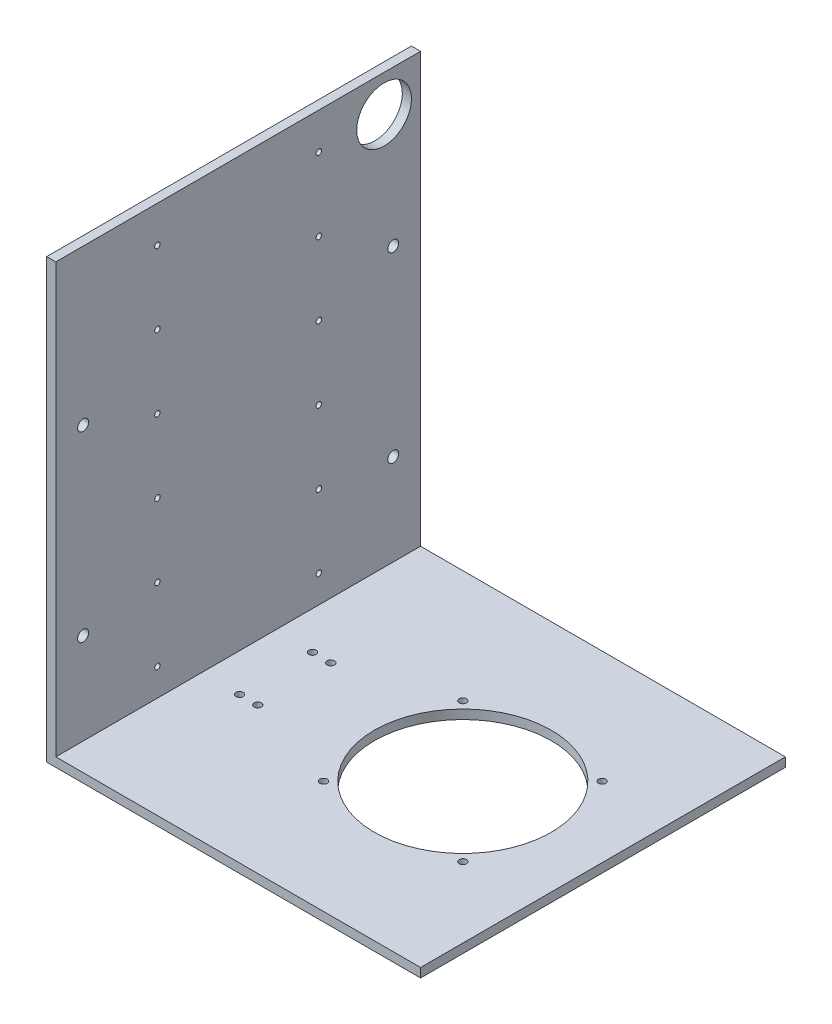
ISO-10303-21;
HEADER;
FILE_DESCRIPTION(('STEP AP214'),'2;1');
FILE_NAME('part.step','',(''),(''),'','','');
FILE_SCHEMA(('AUTOMOTIVE_DESIGN { 1 0 10303 214 1 1 1 1 }'));
ENDSEC;
DATA;
#1=APPLICATION_CONTEXT('core data for automotive mechanical design processes');
#2=APPLICATION_PROTOCOL_DEFINITION('international standard','automotive_design',2000,#1);
#3=PRODUCT_CONTEXT('',#1,'mechanical');
#4=PRODUCT('Part','Part','',(#3));
#5=PRODUCT_RELATED_PRODUCT_CATEGORY('part','',(#4));
#6=PRODUCT_DEFINITION_FORMATION('','',#4);
#7=PRODUCT_DEFINITION_CONTEXT('part definition',#1,'design');
#8=PRODUCT_DEFINITION('design','',#6,#7);
#9=PRODUCT_DEFINITION_SHAPE('','',#8);
#10=(LENGTH_UNIT() NAMED_UNIT(*) SI_UNIT(.MILLI.,.METRE.));
#11=(NAMED_UNIT(*) PLANE_ANGLE_UNIT() SI_UNIT($,.RADIAN.));
#12=(NAMED_UNIT(*) SI_UNIT($,.STERADIAN.) SOLID_ANGLE_UNIT());
#13=UNCERTAINTY_MEASURE_WITH_UNIT(LENGTH_MEASURE(1.E-05),#10,'distance_accuracy_value','');
#14=(GEOMETRIC_REPRESENTATION_CONTEXT(3) GLOBAL_UNCERTAINTY_ASSIGNED_CONTEXT((#13)) GLOBAL_UNIT_ASSIGNED_CONTEXT((#10,
#11,#12)) REPRESENTATION_CONTEXT('',''));
#15=CARTESIAN_POINT('',(0.,0.,0.));
#16=DIRECTION('',(0.,0.,1.));
#17=DIRECTION('',(1.,0.,0.));
#18=AXIS2_PLACEMENT_3D('',#15,#16,#17);
#19=CARTESIAN_POINT('',(5.00000000000001,240.,200.));
#20=DIRECTION('',(0.,-1.,0.));
#21=DIRECTION('',(0.,0.,-1.));
#22=AXIS2_PLACEMENT_3D('',#19,#20,#21);
#23=PLANE('',#22);
#24=DIRECTION('',(-1.,0.,0.));
#25=VECTOR('',#24,1.);
#26=CARTESIAN_POINT('',(5.00000000000001,240.,0.));
#27=LINE('',#26,#25);
#28=CARTESIAN_POINT('',(5.00000000000001,240.,0.));
#29=VERTEX_POINT('',#28);
#30=CARTESIAN_POINT('',(0.,240.,0.));
#31=VERTEX_POINT('',#30);
#32=EDGE_CURVE('E128',#29,#31,#27,.T.);
#33=ORIENTED_EDGE('',*,*,#32,.T.);
#34=DIRECTION('',(0.,0.,-1.));
#35=VECTOR('',#34,1.);
#36=CARTESIAN_POINT('',(0.,240.,200.));
#37=LINE('',#36,#35);
#38=CARTESIAN_POINT('',(0.,240.,200.));
#39=VERTEX_POINT('',#38);
#40=EDGE_CURVE('E13',#39,#31,#37,.T.);
#41=ORIENTED_EDGE('',*,*,#40,.F.);
#42=DIRECTION('',(-1.,0.,0.));
#43=VECTOR('',#42,1.);
#44=CARTESIAN_POINT('',(5.00000000000001,240.,200.));
#45=LINE('',#44,#43);
#46=CARTESIAN_POINT('',(5.00000000000001,240.,200.));
#47=VERTEX_POINT('',#46);
#48=EDGE_CURVE('E139',#47,#39,#45,.T.);
#49=ORIENTED_EDGE('',*,*,#48,.F.);
#50=DIRECTION('',(0.,0.,-1.));
#51=VECTOR('',#50,1.);
#52=CARTESIAN_POINT('',(5.00000000000001,240.,200.));
#53=LINE('',#52,#51);
#54=EDGE_CURVE('E124',#47,#29,#53,.T.);
#55=ORIENTED_EDGE('',*,*,#54,.T.);
#56=EDGE_LOOP('',(#33,#41,#49,#55));
#57=FACE_BOUND('',#56,.T.);
#58=ADVANCED_FACE('F44',(#57),#23,.F.);
#59=CARTESIAN_POINT('',(0.,240.,200.));
#60=DIRECTION('',(1.,0.,0.));
#61=DIRECTION('',(0.,1.,0.));
#62=AXIS2_PLACEMENT_3D('',#59,#60,#61);
#63=PLANE('',#62);
#64=CARTESIAN_POINT('',(0.,140.,55.7499999999992));
#65=DIRECTION('',(1.,0.,0.));
#66=DIRECTION('',(0.,1.,0.));
#67=AXIS2_PLACEMENT_3D('',#64,#65,#66);
#68=CIRCLE('',#67,1.5);
#69=CARTESIAN_POINT('',(0.,141.5,55.7499999999992));
#70=VERTEX_POINT('',#69);
#71=EDGE_CURVE('E595',#70,#70,#68,.F.);
#72=ORIENTED_EDGE('',*,*,#71,.F.);
#73=EDGE_LOOP('',(#72));
#74=FACE_BOUND('',#73,.T.);
#75=CARTESIAN_POINT('',(0.,99.9999999999999,144.249999999999));
#76=DIRECTION('',(1.,0.,0.));
#77=DIRECTION('',(0.,1.,0.));
#78=AXIS2_PLACEMENT_3D('',#75,#76,#77);
#79=CIRCLE('',#78,1.5);
#80=CARTESIAN_POINT('',(0.,101.5,144.249999999999));
#81=VERTEX_POINT('',#80);
#82=EDGE_CURVE('E600',#81,#81,#79,.F.);
#83=ORIENTED_EDGE('',*,*,#82,.F.);
#84=EDGE_LOOP('',(#83));
#85=FACE_BOUND('',#84,.T.);
#86=CARTESIAN_POINT('',(0.,99.9999999999999,55.7499999999988));
#87=DIRECTION('',(1.,0.,0.));
#88=DIRECTION('',(0.,1.,0.));
#89=AXIS2_PLACEMENT_3D('',#86,#87,#88);
#90=CIRCLE('',#89,1.5);
#91=CARTESIAN_POINT('',(0.,101.5,55.7499999999988));
#92=VERTEX_POINT('',#91);
#93=EDGE_CURVE('E607',#92,#92,#90,.F.);
#94=ORIENTED_EDGE('',*,*,#93,.F.);
#95=EDGE_LOOP('',(#94));
#96=FACE_BOUND('',#95,.T.);
#97=CARTESIAN_POINT('',(0.,59.9999999999999,144.249999999998));
#98=DIRECTION('',(1.,0.,0.));
#99=DIRECTION('',(0.,1.,0.));
#100=AXIS2_PLACEMENT_3D('',#97,#98,#99);
#101=CIRCLE('',#100,1.5);
#102=CARTESIAN_POINT('',(0.,61.4999999999999,144.249999999998));
#103=VERTEX_POINT('',#102);
#104=EDGE_CURVE('E611',#103,#103,#101,.F.);
#105=ORIENTED_EDGE('',*,*,#104,.F.);
#106=EDGE_LOOP('',(#105));
#107=FACE_BOUND('',#106,.T.);
#108=CARTESIAN_POINT('',(0.,220.,55.75));
#109=DIRECTION('',(1.,0.,0.));
#110=DIRECTION('',(0.,1.,0.));
#111=AXIS2_PLACEMENT_3D('',#108,#109,#110);
#112=CIRCLE('',#111,1.5);
#113=CARTESIAN_POINT('',(0.,221.5,55.75));
#114=VERTEX_POINT('',#113);
#115=EDGE_CURVE('E575',#114,#114,#112,.F.);
#116=ORIENTED_EDGE('',*,*,#115,.F.);
#117=EDGE_LOOP('',(#116));
#118=FACE_BOUND('',#117,.T.);
#119=CARTESIAN_POINT('',(0.,180.,144.25));
#120=DIRECTION('',(1.,0.,0.));
#121=DIRECTION('',(0.,1.,0.));
#122=AXIS2_PLACEMENT_3D('',#119,#120,#121);
#123=CIRCLE('',#122,1.5);
#124=CARTESIAN_POINT('',(0.,181.5,144.25));
#125=VERTEX_POINT('',#124);
#126=EDGE_CURVE('E576',#125,#125,#123,.F.);
#127=ORIENTED_EDGE('',*,*,#126,.F.);
#128=EDGE_LOOP('',(#127));
#129=FACE_BOUND('',#128,.T.);
#130=CARTESIAN_POINT('',(0.,180.,55.7499999999996));
#131=DIRECTION('',(1.,0.,0.));
#132=DIRECTION('',(0.,1.,0.));
#133=AXIS2_PLACEMENT_3D('',#130,#131,#132);
#134=CIRCLE('',#133,1.5);
#135=CARTESIAN_POINT('',(0.,181.5,55.7499999999996));
#136=VERTEX_POINT('',#135);
#137=EDGE_CURVE('E583',#136,#136,#134,.F.);
#138=ORIENTED_EDGE('',*,*,#137,.F.);
#139=EDGE_LOOP('',(#138));
#140=FACE_BOUND('',#139,.T.);
#141=CARTESIAN_POINT('',(0.,140.,144.249999999999));
#142=DIRECTION('',(1.,0.,0.));
#143=DIRECTION('',(0.,1.,0.));
#144=AXIS2_PLACEMENT_3D('',#141,#142,#143);
#145=CIRCLE('',#144,1.5);
#146=CARTESIAN_POINT('',(0.,141.5,144.249999999999));
#147=VERTEX_POINT('',#146);
#148=EDGE_CURVE('E588',#147,#147,#145,.F.);
#149=ORIENTED_EDGE('',*,*,#148,.F.);
#150=EDGE_LOOP('',(#149));
#151=FACE_BOUND('',#150,.T.);
#152=CARTESIAN_POINT('',(0.,19.9999999999999,55.7499999999979));
#153=DIRECTION('',(1.,0.,0.));
#154=DIRECTION('',(0.,1.,0.));
#155=AXIS2_PLACEMENT_3D('',#152,#153,#154);
#156=CIRCLE('',#155,1.5);
#157=CARTESIAN_POINT('',(0.,21.4999999999999,55.7499999999979));
#158=VERTEX_POINT('',#157);
#159=EDGE_CURVE('E630',#158,#158,#156,.F.);
#160=ORIENTED_EDGE('',*,*,#159,.F.);
#161=EDGE_LOOP('',(#160));
#162=FACE_BOUND('',#161,.T.);
#163=CARTESIAN_POINT('',(0.,19.9999999999999,144.249999999998));
#164=DIRECTION('',(1.,0.,0.));
#165=DIRECTION('',(0.,1.,0.));
#166=AXIS2_PLACEMENT_3D('',#163,#164,#165);
#167=CIRCLE('',#166,1.5);
#168=CARTESIAN_POINT('',(0.,21.4999999999999,144.249999999998));
#169=VERTEX_POINT('',#168);
#170=EDGE_CURVE('E623',#169,#169,#167,.F.);
#171=ORIENTED_EDGE('',*,*,#170,.F.);
#172=EDGE_LOOP('',(#171));
#173=FACE_BOUND('',#172,.T.);
#174=CARTESIAN_POINT('',(0.,59.9999999999999,55.7499999999983));
#175=DIRECTION('',(1.,0.,0.));
#176=DIRECTION('',(0.,1.,0.));
#177=AXIS2_PLACEMENT_3D('',#174,#175,#176);
#178=CIRCLE('',#177,1.5);
#179=CARTESIAN_POINT('',(0.,61.4999999999999,55.7499999999983));
#180=VERTEX_POINT('',#179);
#181=EDGE_CURVE('E618',#180,#180,#178,.F.);
#182=ORIENTED_EDGE('',*,*,#181,.F.);
#183=EDGE_LOOP('',(#182));
#184=FACE_BOUND('',#183,.T.);
#185=CARTESIAN_POINT('',(0.,220.,144.25));
#186=DIRECTION('',(1.,0.,0.));
#187=DIRECTION('',(0.,1.,0.));
#188=AXIS2_PLACEMENT_3D('',#185,#186,#187);
#189=CIRCLE('',#188,1.5);
#190=CARTESIAN_POINT('',(0.,221.5,144.25));
#191=VERTEX_POINT('',#190);
#192=EDGE_CURVE('E569',#191,#191,#189,.F.);
#193=ORIENTED_EDGE('',*,*,#192,.F.);
#194=EDGE_LOOP('',(#193));
#195=FACE_BOUND('',#194,.T.);
#196=CARTESIAN_POINT('',(0.,155.,185.));
#197=DIRECTION('',(1.,0.,0.));
#198=DIRECTION('',(0.,1.,0.));
#199=AXIS2_PLACEMENT_3D('',#196,#197,#198);
#200=CIRCLE('',#199,2.99999999999999);
#201=CARTESIAN_POINT('',(0.,158.,185.));
#202=VERTEX_POINT('',#201);
#203=EDGE_CURVE('E551',#202,#202,#200,.F.);
#204=ORIENTED_EDGE('',*,*,#203,.F.);
#205=EDGE_LOOP('',(#204));
#206=FACE_BOUND('',#205,.T.);
#207=CARTESIAN_POINT('',(0.,55.,15.));
#208=DIRECTION('',(1.,0.,0.));
#209=DIRECTION('',(0.,1.,0.));
#210=AXIS2_PLACEMENT_3D('',#207,#208,#209);
#211=CIRCLE('',#210,3.);
#212=CARTESIAN_POINT('',(0.,58.,15.));
#213=VERTEX_POINT('',#212);
#214=EDGE_CURVE('E552',#213,#213,#211,.F.);
#215=ORIENTED_EDGE('',*,*,#214,.F.);
#216=EDGE_LOOP('',(#215));
#217=FACE_BOUND('',#216,.T.);
#218=CARTESIAN_POINT('',(0.,155.,15.));
#219=DIRECTION('',(1.,0.,0.));
#220=DIRECTION('',(0.,1.,0.));
#221=AXIS2_PLACEMENT_3D('',#218,#219,#220);
#222=CIRCLE('',#221,3.);
#223=CARTESIAN_POINT('',(0.,158.,15.));
#224=VERTEX_POINT('',#223);
#225=EDGE_CURVE('E559',#224,#224,#222,.F.);
#226=ORIENTED_EDGE('',*,*,#225,.F.);
#227=EDGE_LOOP('',(#226));
#228=FACE_BOUND('',#227,.T.);
#229=CARTESIAN_POINT('',(0.,55.,185.));
#230=DIRECTION('',(1.,0.,0.));
#231=DIRECTION('',(0.,1.,0.));
#232=AXIS2_PLACEMENT_3D('',#229,#230,#231);
#233=CIRCLE('',#232,2.99999999999999);
#234=CARTESIAN_POINT('',(0.,58.,185.));
#235=VERTEX_POINT('',#234);
#236=EDGE_CURVE('E545',#235,#235,#233,.F.);
#237=ORIENTED_EDGE('',*,*,#236,.F.);
#238=EDGE_LOOP('',(#237));
#239=FACE_BOUND('',#238,.T.);
#240=CARTESIAN_POINT('',(0.,220.,20.));
#241=DIRECTION('',(1.,0.,0.));
#242=DIRECTION('',(0.,1.,0.));
#243=AXIS2_PLACEMENT_3D('',#240,#241,#242);
#244=CIRCLE('',#243,15.);
#245=CARTESIAN_POINT('',(0.,235.,20.));
#246=VERTEX_POINT('',#245);
#247=EDGE_CURVE('E529',#246,#246,#244,.T.);
#248=ORIENTED_EDGE('',*,*,#247,.T.);
#249=EDGE_LOOP('',(#248));
#250=FACE_BOUND('',#249,.T.);
#251=DIRECTION('',(0.,-1.,0.));
#252=VECTOR('',#251,1.);
#253=CARTESIAN_POINT('',(0.,240.,0.));
#254=LINE('',#253,#252);
#255=CARTESIAN_POINT('',(0.,0.,0.));
#256=VERTEX_POINT('',#255);
#257=EDGE_CURVE('E131',#31,#256,#254,.T.);
#258=ORIENTED_EDGE('',*,*,#257,.T.);
#259=DIRECTION('',(0.,0.,-1.));
#260=VECTOR('',#259,1.);
#261=CARTESIAN_POINT('',(0.,0.,200.));
#262=LINE('',#261,#260);
#263=CARTESIAN_POINT('',(0.,0.,200.));
#264=VERTEX_POINT('',#263);
#265=EDGE_CURVE('E52',#264,#256,#262,.T.);
#266=ORIENTED_EDGE('',*,*,#265,.F.);
#267=DIRECTION('',(0.,-1.,0.));
#268=VECTOR('',#267,1.);
#269=CARTESIAN_POINT('',(0.,240.,200.));
#270=LINE('',#269,#268);
#271=EDGE_CURVE('E97',#39,#264,#270,.T.);
#272=ORIENTED_EDGE('',*,*,#271,.F.);
#273=ORIENTED_EDGE('',*,*,#40,.T.);
#274=EDGE_LOOP('',(#258,#266,#272,#273));
#275=FACE_BOUND('',#274,.T.);
#276=ADVANCED_FACE('F167',(#74,#85,#96,#107,#118,#129,#140,#151,#162,#173,#184,#195,#206,#217,
#228,#239,#250,#275),#63,.F.);
#277=CARTESIAN_POINT('',(0.,0.,200.));
#278=DIRECTION('',(0.,1.,0.));
#279=DIRECTION('',(0.,0.,1.));
#280=AXIS2_PLACEMENT_3D('',#277,#278,#279);
#281=PLANE('',#280);
#282=CARTESIAN_POINT('',(35.75,0.,80.));
#283=DIRECTION('',(0.,1.,0.));
#284=DIRECTION('',(0.,0.,1.));
#285=AXIS2_PLACEMENT_3D('',#282,#283,#284);
#286=CIRCLE('',#285,2.);
#287=CARTESIAN_POINT('',(35.75,0.,82.));
#288=VERTEX_POINT('',#287);
#289=EDGE_CURVE('E522',#288,#288,#286,.F.);
#290=ORIENTED_EDGE('',*,*,#289,.F.);
#291=EDGE_LOOP('',(#290));
#292=FACE_BOUND('',#291,.T.);
#293=CARTESIAN_POINT('',(35.75,0.,120.));
#294=DIRECTION('',(0.,1.,0.));
#295=DIRECTION('',(0.,0.,1.));
#296=AXIS2_PLACEMENT_3D('',#293,#294,#295);
#297=CIRCLE('',#296,2.);
#298=CARTESIAN_POINT('',(35.75,0.,122.));
#299=VERTEX_POINT('',#298);
#300=EDGE_CURVE('E530',#299,#299,#297,.F.);
#301=ORIENTED_EDGE('',*,*,#300,.F.);
#302=EDGE_LOOP('',(#301));
#303=FACE_BOUND('',#302,.T.);
#304=CARTESIAN_POINT('',(25.75,0.,120.));
#305=DIRECTION('',(0.,1.,0.));
#306=DIRECTION('',(0.,0.,1.));
#307=AXIS2_PLACEMENT_3D('',#304,#305,#306);
#308=CIRCLE('',#307,2.);
#309=CARTESIAN_POINT('',(25.75,0.,122.));
#310=VERTEX_POINT('',#309);
#311=EDGE_CURVE('E521',#310,#310,#308,.F.);
#312=ORIENTED_EDGE('',*,*,#311,.F.);
#313=EDGE_LOOP('',(#312));
#314=FACE_BOUND('',#313,.T.);
#315=CARTESIAN_POINT('',(25.75,0.,80.));
#316=DIRECTION('',(0.,1.,0.));
#317=DIRECTION('',(0.,0.,1.));
#318=AXIS2_PLACEMENT_3D('',#315,#316,#317);
#319=CIRCLE('',#318,2.);
#320=CARTESIAN_POINT('',(25.75,0.,82.));
#321=VERTEX_POINT('',#320);
#322=EDGE_CURVE('E499',#321,#321,#319,.F.);
#323=ORIENTED_EDGE('',*,*,#322,.F.);
#324=EDGE_LOOP('',(#323));
#325=FACE_BOUND('',#324,.T.);
#326=CARTESIAN_POINT('',(166.352614250389,0.,138.182532328278));
#327=DIRECTION('',(0.,1.,0.));
#328=DIRECTION('',(0.,0.,1.));
#329=AXIS2_PLACEMENT_3D('',#326,#327,#328);
#330=CIRCLE('',#329,2.);
#331=CARTESIAN_POINT('',(166.352614250389,0.,140.182532328278));
#332=VERTEX_POINT('',#331);
#333=EDGE_CURVE('E492',#332,#332,#330,.F.);
#334=ORIENTED_EDGE('',*,*,#333,.F.);
#335=EDGE_LOOP('',(#334));
#336=FACE_BOUND('',#335,.T.);
#337=CARTESIAN_POINT('',(89.9826142503892,0.,138.182532328278));
#338=DIRECTION('',(0.,1.,0.));
#339=DIRECTION('',(0.,0.,1.));
#340=AXIS2_PLACEMENT_3D('',#337,#338,#339);
#341=CIRCLE('',#340,2.);
#342=CARTESIAN_POINT('',(89.9826142503892,0.,140.182532328278));
#343=VERTEX_POINT('',#342);
#344=EDGE_CURVE('E500',#343,#343,#341,.F.);
#345=ORIENTED_EDGE('',*,*,#344,.F.);
#346=EDGE_LOOP('',(#345));
#347=FACE_BOUND('',#346,.T.);
#348=CARTESIAN_POINT('',(166.352614250389,0.,61.8174676717219));
#349=DIRECTION('',(0.,1.,0.));
#350=DIRECTION('',(0.,0.,1.));
#351=AXIS2_PLACEMENT_3D('',#348,#349,#350);
#352=CIRCLE('',#351,2.);
#353=CARTESIAN_POINT('',(166.352614250389,0.,63.8174676717219));
#354=VERTEX_POINT('',#353);
#355=EDGE_CURVE('E506',#354,#354,#352,.F.);
#356=ORIENTED_EDGE('',*,*,#355,.F.);
#357=EDGE_LOOP('',(#356));
#358=FACE_BOUND('',#357,.T.);
#359=CARTESIAN_POINT('',(89.9826142503892,0.,61.8174676717219));
#360=DIRECTION('',(0.,1.,0.));
#361=DIRECTION('',(0.,0.,1.));
#362=AXIS2_PLACEMENT_3D('',#359,#360,#361);
#363=CIRCLE('',#362,2.);
#364=CARTESIAN_POINT('',(89.9826142503892,0.,63.8174676717219));
#365=VERTEX_POINT('',#364);
#366=EDGE_CURVE('E487',#365,#365,#363,.F.);
#367=ORIENTED_EDGE('',*,*,#366,.F.);
#368=EDGE_LOOP('',(#367));
#369=FACE_BOUND('',#368,.T.);
#370=CARTESIAN_POINT('',(128.167614250389,0.,100.));
#371=DIRECTION('',(0.,1.,0.));
#372=DIRECTION('',(0.,0.,1.));
#373=AXIS2_PLACEMENT_3D('',#370,#371,#372);
#374=CIRCLE('',#373,48.5);
#375=CARTESIAN_POINT('',(128.167614250389,0.,148.5));
#376=VERTEX_POINT('',#375);
#377=EDGE_CURVE('E132',#376,#376,#374,.F.);
#378=ORIENTED_EDGE('',*,*,#377,.F.);
#379=EDGE_LOOP('',(#378));
#380=FACE_BOUND('',#379,.T.);
#381=DIRECTION('',(1.,0.,0.));
#382=VECTOR('',#381,1.);
#383=CARTESIAN_POINT('',(0.,0.,0.));
#384=LINE('',#383,#382);
#385=CARTESIAN_POINT('',(205.,0.,0.));
#386=VERTEX_POINT('',#385);
#387=EDGE_CURVE('E134',#256,#386,#384,.T.);
#388=ORIENTED_EDGE('',*,*,#387,.T.);
#389=DIRECTION('',(0.,0.,-1.));
#390=VECTOR('',#389,1.);
#391=CARTESIAN_POINT('',(205.,0.,200.));
#392=LINE('',#391,#390);
#393=CARTESIAN_POINT('',(205.,0.,200.));
#394=VERTEX_POINT('',#393);
#395=EDGE_CURVE('E119',#394,#386,#392,.T.);
#396=ORIENTED_EDGE('',*,*,#395,.F.);
#397=DIRECTION('',(1.,0.,0.));
#398=VECTOR('',#397,1.);
#399=CARTESIAN_POINT('',(0.,0.,200.));
#400=LINE('',#399,#398);
#401=EDGE_CURVE('E110',#264,#394,#400,.T.);
#402=ORIENTED_EDGE('',*,*,#401,.F.);
#403=ORIENTED_EDGE('',*,*,#265,.T.);
#404=EDGE_LOOP('',(#388,#396,#402,#403));
#405=FACE_BOUND('',#404,.T.);
#406=ADVANCED_FACE('F145',(#292,#303,#314,#325,#336,#347,#358,#369,#380,#405),#281,.F.);
#407=CARTESIAN_POINT('',(205.,0.,200.));
#408=DIRECTION('',(-1.,0.,0.));
#409=DIRECTION('',(0.,0.,1.));
#410=AXIS2_PLACEMENT_3D('',#407,#408,#409);
#411=PLANE('',#410);
#412=DIRECTION('',(0.,1.,0.));
#413=VECTOR('',#412,1.);
#414=CARTESIAN_POINT('',(205.,0.,0.));
#415=LINE('',#414,#413);
#416=CARTESIAN_POINT('',(205.,5.00000000000002,0.));
#417=VERTEX_POINT('',#416);
#418=EDGE_CURVE('E118',#386,#417,#415,.T.);
#419=ORIENTED_EDGE('',*,*,#418,.T.);
#420=DIRECTION('',(0.,0.,-1.));
#421=VECTOR('',#420,1.);
#422=CARTESIAN_POINT('',(205.,5.00000000000002,200.));
#423=LINE('',#422,#421);
#424=CARTESIAN_POINT('',(205.,5.00000000000002,200.));
#425=VERTEX_POINT('',#424);
#426=EDGE_CURVE('E115',#425,#417,#423,.T.);
#427=ORIENTED_EDGE('',*,*,#426,.F.);
#428=DIRECTION('',(0.,1.,0.));
#429=VECTOR('',#428,1.);
#430=CARTESIAN_POINT('',(205.,0.,200.));
#431=LINE('',#430,#429);
#432=EDGE_CURVE('E104',#394,#425,#431,.T.);
#433=ORIENTED_EDGE('',*,*,#432,.F.);
#434=ORIENTED_EDGE('',*,*,#395,.T.);
#435=EDGE_LOOP('',(#419,#427,#433,#434));
#436=FACE_BOUND('',#435,.T.);
#437=ADVANCED_FACE('F116',(#436),#411,.F.);
#438=CARTESIAN_POINT('',(205.,5.00000000000002,200.));
#439=DIRECTION('',(0.,-1.,0.));
#440=DIRECTION('',(1.,0.,0.));
#441=AXIS2_PLACEMENT_3D('',#438,#439,#440);
#442=PLANE('',#441);
#443=CARTESIAN_POINT('',(35.75,4.99999999999999,80.));
#444=DIRECTION('',(0.,1.,0.));
#445=DIRECTION('',(1.,0.,0.));
#446=AXIS2_PLACEMENT_3D('',#443,#444,#445);
#447=CIRCLE('',#446,2.);
#448=CARTESIAN_POINT('',(37.7500000000001,4.99999999999999,80.));
#449=VERTEX_POINT('',#448);
#450=EDGE_CURVE('E526',#449,#449,#447,.T.);
#451=ORIENTED_EDGE('',*,*,#450,.F.);
#452=EDGE_LOOP('',(#451));
#453=FACE_BOUND('',#452,.T.);
#454=CARTESIAN_POINT('',(35.75,4.99999999999999,120.));
#455=DIRECTION('',(0.,1.,0.));
#456=DIRECTION('',(-1.,0.,0.));
#457=AXIS2_PLACEMENT_3D('',#454,#455,#456);
#458=CIRCLE('',#457,2.);
#459=CARTESIAN_POINT('',(33.75,4.99999999999999,120.));
#460=VERTEX_POINT('',#459);
#461=EDGE_CURVE('E525',#460,#460,#458,.T.);
#462=ORIENTED_EDGE('',*,*,#461,.F.);
#463=EDGE_LOOP('',(#462));
#464=FACE_BOUND('',#463,.T.);
#465=CARTESIAN_POINT('',(25.75,4.99999999999999,120.));
#466=DIRECTION('',(0.,1.,0.));
#467=DIRECTION('',(1.,0.,0.));
#468=AXIS2_PLACEMENT_3D('',#465,#466,#467);
#469=CIRCLE('',#468,2.);
#470=CARTESIAN_POINT('',(27.7500000000001,4.99999999999999,120.));
#471=VERTEX_POINT('',#470);
#472=EDGE_CURVE('E533',#471,#471,#469,.T.);
#473=ORIENTED_EDGE('',*,*,#472,.F.);
#474=EDGE_LOOP('',(#473));
#475=FACE_BOUND('',#474,.T.);
#476=CARTESIAN_POINT('',(25.75,4.99999999999999,80.));
#477=DIRECTION('',(0.,1.,0.));
#478=DIRECTION('',(-1.,0.,0.));
#479=AXIS2_PLACEMENT_3D('',#476,#477,#478);
#480=CIRCLE('',#479,2.);
#481=CARTESIAN_POINT('',(23.75,4.99999999999999,80.));
#482=VERTEX_POINT('',#481);
#483=EDGE_CURVE('E518',#482,#482,#480,.T.);
#484=ORIENTED_EDGE('',*,*,#483,.F.);
#485=EDGE_LOOP('',(#484));
#486=FACE_BOUND('',#485,.T.);
#487=CARTESIAN_POINT('',(166.352614250389,5.00000000000001,138.182532328278));
#488=DIRECTION('',(0.,1.,0.));
#489=DIRECTION('',(-1.,0.,0.));
#490=AXIS2_PLACEMENT_3D('',#487,#488,#489);
#491=CIRCLE('',#490,2.);
#492=CARTESIAN_POINT('',(164.352614250389,5.00000000000001,138.182532328278));
#493=VERTEX_POINT('',#492);
#494=EDGE_CURVE('E496',#493,#493,#491,.T.);
#495=ORIENTED_EDGE('',*,*,#494,.F.);
#496=EDGE_LOOP('',(#495));
#497=FACE_BOUND('',#496,.T.);
#498=CARTESIAN_POINT('',(89.9826142503892,5.,138.182532328278));
#499=DIRECTION('',(0.,1.,0.));
#500=DIRECTION('',(-1.,0.,0.));
#501=AXIS2_PLACEMENT_3D('',#498,#499,#500);
#502=CIRCLE('',#501,2.);
#503=CARTESIAN_POINT('',(87.9826142503891,5.,138.182532328278));
#504=VERTEX_POINT('',#503);
#505=EDGE_CURVE('E495',#504,#504,#502,.T.);
#506=ORIENTED_EDGE('',*,*,#505,.F.);
#507=EDGE_LOOP('',(#506));
#508=FACE_BOUND('',#507,.T.);
#509=CARTESIAN_POINT('',(166.352614250389,5.00000000000001,61.8174676717219));
#510=DIRECTION('',(0.,1.,0.));
#511=DIRECTION('',(-1.,0.,0.));
#512=AXIS2_PLACEMENT_3D('',#509,#510,#511);
#513=CIRCLE('',#512,2.);
#514=CARTESIAN_POINT('',(164.352614250389,5.00000000000001,61.8174676717219));
#515=VERTEX_POINT('',#514);
#516=EDGE_CURVE('E503',#515,#515,#513,.T.);
#517=ORIENTED_EDGE('',*,*,#516,.F.);
#518=EDGE_LOOP('',(#517));
#519=FACE_BOUND('',#518,.T.);
#520=CARTESIAN_POINT('',(89.9826142503892,5.,61.8174676717219));
#521=DIRECTION('',(0.,1.,0.));
#522=DIRECTION('',(-1.,0.,0.));
#523=AXIS2_PLACEMENT_3D('',#520,#521,#522);
#524=CIRCLE('',#523,2.);
#525=CARTESIAN_POINT('',(87.9826142503891,5.,61.8174676717219));
#526=VERTEX_POINT('',#525);
#527=EDGE_CURVE('E509',#526,#526,#524,.T.);
#528=ORIENTED_EDGE('',*,*,#527,.F.);
#529=EDGE_LOOP('',(#528));
#530=FACE_BOUND('',#529,.T.);
#531=CARTESIAN_POINT('',(128.167614250389,5.00000000000001,100.));
#532=DIRECTION('',(0.,1.,0.));
#533=DIRECTION('',(-1.,0.,0.));
#534=AXIS2_PLACEMENT_3D('',#531,#532,#533);
#535=CIRCLE('',#534,48.5);
#536=CARTESIAN_POINT('',(79.6676142503891,5.,100.));
#537=VERTEX_POINT('',#536);
#538=EDGE_CURVE('E482',#537,#537,#535,.T.);
#539=ORIENTED_EDGE('',*,*,#538,.F.);
#540=EDGE_LOOP('',(#539));
#541=FACE_BOUND('',#540,.T.);
#542=DIRECTION('',(-1.,0.,0.));
#543=VECTOR('',#542,1.);
#544=CARTESIAN_POINT('',(205.,5.00000000000002,0.));
#545=LINE('',#544,#543);
#546=CARTESIAN_POINT('',(5.,4.99999999999999,0.));
#547=VERTEX_POINT('',#546);
#548=EDGE_CURVE('E83',#417,#547,#545,.T.);
#549=ORIENTED_EDGE('',*,*,#548,.T.);
#550=DIRECTION('',(0.,0.,-1.));
#551=VECTOR('',#550,1.);
#552=CARTESIAN_POINT('',(5.,4.99999999999999,200.));
#553=LINE('',#552,#551);
#554=CARTESIAN_POINT('',(5.,4.99999999999999,200.));
#555=VERTEX_POINT('',#554);
#556=EDGE_CURVE('E120',#555,#547,#553,.T.);
#557=ORIENTED_EDGE('',*,*,#556,.F.);
#558=DIRECTION('',(-1.,0.,0.));
#559=VECTOR('',#558,1.);
#560=CARTESIAN_POINT('',(205.,5.00000000000002,200.));
#561=LINE('',#560,#559);
#562=EDGE_CURVE('E108',#425,#555,#561,.T.);
#563=ORIENTED_EDGE('',*,*,#562,.F.);
#564=ORIENTED_EDGE('',*,*,#426,.T.);
#565=EDGE_LOOP('',(#549,#557,#563,#564));
#566=FACE_BOUND('',#565,.T.);
#567=ADVANCED_FACE('F122',(#453,#464,#475,#486,#497,#508,#519,#530,#541,#566),#442,.F.);
#568=CARTESIAN_POINT('',(5.,4.99999999999999,200.));
#569=DIRECTION('',(-1.,0.,0.));
#570=DIRECTION('',(0.,-1.,0.));
#571=AXIS2_PLACEMENT_3D('',#568,#569,#570);
#572=PLANE('',#571);
#573=CARTESIAN_POINT('',(5.00000000000001,140.,55.7499999999992));
#574=DIRECTION('',(1.,0.,0.));
#575=DIRECTION('',(0.,-1.,0.));
#576=AXIS2_PLACEMENT_3D('',#573,#574,#575);
#577=CIRCLE('',#576,1.5);
#578=CARTESIAN_POINT('',(5.00000000000001,138.5,55.7499999999992));
#579=VERTEX_POINT('',#578);
#580=EDGE_CURVE('E603',#579,#579,#577,.T.);
#581=ORIENTED_EDGE('',*,*,#580,.F.);
#582=EDGE_LOOP('',(#581));
#583=FACE_BOUND('',#582,.T.);
#584=CARTESIAN_POINT('',(5.00000000000001,99.9999999999999,144.249999999999));
#585=DIRECTION('',(1.,0.,0.));
#586=DIRECTION('',(0.,1.,0.));
#587=AXIS2_PLACEMENT_3D('',#584,#585,#586);
#588=CIRCLE('',#587,1.5);
#589=CARTESIAN_POINT('',(5.00000000000001,101.5,144.249999999999));
#590=VERTEX_POINT('',#589);
#591=EDGE_CURVE('E604',#590,#590,#588,.T.);
#592=ORIENTED_EDGE('',*,*,#591,.F.);
#593=EDGE_LOOP('',(#592));
#594=FACE_BOUND('',#593,.T.);
#595=CARTESIAN_POINT('',(5.00000000000001,99.9999999999999,55.7499999999988));
#596=DIRECTION('',(1.,0.,0.));
#597=DIRECTION('',(0.,-1.,0.));
#598=AXIS2_PLACEMENT_3D('',#595,#596,#597);
#599=CIRCLE('',#598,1.5);
#600=CARTESIAN_POINT('',(5.00000000000001,98.4999999999999,55.7499999999988));
#601=VERTEX_POINT('',#600);
#602=EDGE_CURVE('E614',#601,#601,#599,.T.);
#603=ORIENTED_EDGE('',*,*,#602,.F.);
#604=EDGE_LOOP('',(#603));
#605=FACE_BOUND('',#604,.T.);
#606=CARTESIAN_POINT('',(5.00000000000001,59.9999999999999,144.249999999998));
#607=DIRECTION('',(1.,0.,0.));
#608=DIRECTION('',(0.,1.,0.));
#609=AXIS2_PLACEMENT_3D('',#606,#607,#608);
#610=CIRCLE('',#609,1.5);
#611=CARTESIAN_POINT('',(5.00000000000001,61.4999999999999,144.249999999998));
#612=VERTEX_POINT('',#611);
#613=EDGE_CURVE('E615',#612,#612,#610,.T.);
#614=ORIENTED_EDGE('',*,*,#613,.F.);
#615=EDGE_LOOP('',(#614));
#616=FACE_BOUND('',#615,.T.);
#617=CARTESIAN_POINT('',(5.00000000000001,220.,55.75));
#618=DIRECTION('',(1.,0.,0.));
#619=DIRECTION('',(0.,-1.,0.));
#620=AXIS2_PLACEMENT_3D('',#617,#618,#619);
#621=CIRCLE('',#620,1.5);
#622=CARTESIAN_POINT('',(5.00000000000001,218.5,55.75));
#623=VERTEX_POINT('',#622);
#624=EDGE_CURVE('E579',#623,#623,#621,.T.);
#625=ORIENTED_EDGE('',*,*,#624,.F.);
#626=EDGE_LOOP('',(#625));
#627=FACE_BOUND('',#626,.T.);
#628=CARTESIAN_POINT('',(5.00000000000001,180.,144.25));
#629=DIRECTION('',(1.,0.,0.));
#630=DIRECTION('',(0.,1.,0.));
#631=AXIS2_PLACEMENT_3D('',#628,#629,#630);
#632=CIRCLE('',#631,1.5);
#633=CARTESIAN_POINT('',(5.00000000000001,181.5,144.25));
#634=VERTEX_POINT('',#633);
#635=EDGE_CURVE('E580',#634,#634,#632,.T.);
#636=ORIENTED_EDGE('',*,*,#635,.F.);
#637=EDGE_LOOP('',(#636));
#638=FACE_BOUND('',#637,.T.);
#639=CARTESIAN_POINT('',(5.00000000000001,180.,55.7499999999996));
#640=DIRECTION('',(1.,0.,0.));
#641=DIRECTION('',(0.,-1.,0.));
#642=AXIS2_PLACEMENT_3D('',#639,#640,#641);
#643=CIRCLE('',#642,1.5);
#644=CARTESIAN_POINT('',(5.00000000000001,178.5,55.7499999999996));
#645=VERTEX_POINT('',#644);
#646=EDGE_CURVE('E591',#645,#645,#643,.T.);
#647=ORIENTED_EDGE('',*,*,#646,.F.);
#648=EDGE_LOOP('',(#647));
#649=FACE_BOUND('',#648,.T.);
#650=CARTESIAN_POINT('',(5.00000000000001,140.,144.249999999999));
#651=DIRECTION('',(1.,0.,0.));
#652=DIRECTION('',(0.,1.,0.));
#653=AXIS2_PLACEMENT_3D('',#650,#651,#652);
#654=CIRCLE('',#653,1.5);
#655=CARTESIAN_POINT('',(5.00000000000001,141.5,144.249999999999));
#656=VERTEX_POINT('',#655);
#657=EDGE_CURVE('E592',#656,#656,#654,.T.);
#658=ORIENTED_EDGE('',*,*,#657,.F.);
#659=EDGE_LOOP('',(#658));
#660=FACE_BOUND('',#659,.T.);
#661=CARTESIAN_POINT('',(5.,19.9999999999999,55.7499999999979));
#662=DIRECTION('',(1.,0.,0.));
#663=DIRECTION('',(0.,-1.,0.));
#664=AXIS2_PLACEMENT_3D('',#661,#662,#663);
#665=CIRCLE('',#664,1.5);
#666=CARTESIAN_POINT('',(5.,18.4999999999999,55.7499999999979));
#667=VERTEX_POINT('',#666);
#668=EDGE_CURVE('E637',#667,#667,#665,.T.);
#669=ORIENTED_EDGE('',*,*,#668,.F.);
#670=EDGE_LOOP('',(#669));
#671=FACE_BOUND('',#670,.T.);
#672=CARTESIAN_POINT('',(5.,19.9999999999999,144.249999999998));
#673=DIRECTION('',(1.,0.,0.));
#674=DIRECTION('',(0.,1.,0.));
#675=AXIS2_PLACEMENT_3D('',#672,#673,#674);
#676=CIRCLE('',#675,1.5);
#677=CARTESIAN_POINT('',(5.,21.4999999999999,144.249999999998));
#678=VERTEX_POINT('',#677);
#679=EDGE_CURVE('E627',#678,#678,#676,.T.);
#680=ORIENTED_EDGE('',*,*,#679,.F.);
#681=EDGE_LOOP('',(#680));
#682=FACE_BOUND('',#681,.T.);
#683=CARTESIAN_POINT('',(5.00000000000001,59.9999999999999,55.7499999999983));
#684=DIRECTION('',(1.,0.,0.));
#685=DIRECTION('',(0.,-1.,0.));
#686=AXIS2_PLACEMENT_3D('',#683,#684,#685);
#687=CIRCLE('',#686,1.5);
#688=CARTESIAN_POINT('',(5.00000000000001,58.4999999999999,55.7499999999983));
#689=VERTEX_POINT('',#688);
#690=EDGE_CURVE('E626',#689,#689,#687,.T.);
#691=ORIENTED_EDGE('',*,*,#690,.F.);
#692=EDGE_LOOP('',(#691));
#693=FACE_BOUND('',#692,.T.);
#694=CARTESIAN_POINT('',(5.00000000000001,220.,144.25));
#695=DIRECTION('',(1.,0.,0.));
#696=DIRECTION('',(0.,1.,0.));
#697=AXIS2_PLACEMENT_3D('',#694,#695,#696);
#698=CIRCLE('',#697,1.5);
#699=CARTESIAN_POINT('',(5.00000000000001,221.5,144.25));
#700=VERTEX_POINT('',#699);
#701=EDGE_CURVE('E572',#700,#700,#698,.T.);
#702=ORIENTED_EDGE('',*,*,#701,.F.);
#703=EDGE_LOOP('',(#702));
#704=FACE_BOUND('',#703,.T.);
#705=CARTESIAN_POINT('',(5.00000000000001,155.,185.));
#706=DIRECTION('',(1.,0.,0.));
#707=DIRECTION('',(0.,1.,0.));
#708=AXIS2_PLACEMENT_3D('',#705,#706,#707);
#709=CIRCLE('',#708,2.99999999999999);
#710=CARTESIAN_POINT('',(5.00000000000001,158.,185.));
#711=VERTEX_POINT('',#710);
#712=EDGE_CURVE('E555',#711,#711,#709,.T.);
#713=ORIENTED_EDGE('',*,*,#712,.F.);
#714=EDGE_LOOP('',(#713));
#715=FACE_BOUND('',#714,.T.);
#716=CARTESIAN_POINT('',(5.00000000000001,55.,15.));
#717=DIRECTION('',(1.,0.,0.));
#718=DIRECTION('',(0.,-1.,0.));
#719=AXIS2_PLACEMENT_3D('',#716,#717,#718);
#720=CIRCLE('',#719,3.);
#721=CARTESIAN_POINT('',(5.00000000000001,52.,15.));
#722=VERTEX_POINT('',#721);
#723=EDGE_CURVE('E556',#722,#722,#720,.T.);
#724=ORIENTED_EDGE('',*,*,#723,.F.);
#725=EDGE_LOOP('',(#724));
#726=FACE_BOUND('',#725,.T.);
#727=CARTESIAN_POINT('',(5.00000000000001,155.,15.));
#728=DIRECTION('',(1.,0.,0.));
#729=DIRECTION('',(0.,-1.,0.));
#730=AXIS2_PLACEMENT_3D('',#727,#728,#729);
#731=CIRCLE('',#730,3.);
#732=CARTESIAN_POINT('',(5.00000000000001,152.,15.));
#733=VERTEX_POINT('',#732);
#734=EDGE_CURVE('E566',#733,#733,#731,.T.);
#735=ORIENTED_EDGE('',*,*,#734,.F.);
#736=EDGE_LOOP('',(#735));
#737=FACE_BOUND('',#736,.T.);
#738=CARTESIAN_POINT('',(5.00000000000001,55.,185.));
#739=DIRECTION('',(1.,0.,0.));
#740=DIRECTION('',(0.,1.,0.));
#741=AXIS2_PLACEMENT_3D('',#738,#739,#740);
#742=CIRCLE('',#741,2.99999999999999);
#743=CARTESIAN_POINT('',(5.00000000000001,58.,185.));
#744=VERTEX_POINT('',#743);
#745=EDGE_CURVE('E548',#744,#744,#742,.T.);
#746=ORIENTED_EDGE('',*,*,#745,.F.);
#747=EDGE_LOOP('',(#746));
#748=FACE_BOUND('',#747,.T.);
#749=CARTESIAN_POINT('',(5.00000000000001,220.,20.));
#750=DIRECTION('',(1.,0.,0.));
#751=DIRECTION('',(0.,1.,0.));
#752=AXIS2_PLACEMENT_3D('',#749,#750,#751);
#753=CIRCLE('',#752,15.);
#754=CARTESIAN_POINT('',(5.00000000000001,235.,20.));
#755=VERTEX_POINT('',#754);
#756=EDGE_CURVE('E542',#755,#755,#753,.T.);
#757=ORIENTED_EDGE('',*,*,#756,.F.);
#758=EDGE_LOOP('',(#757));
#759=FACE_BOUND('',#758,.T.);
#760=DIRECTION('',(0.,1.,0.));
#761=VECTOR('',#760,1.);
#762=CARTESIAN_POINT('',(5.,4.99999999999999,0.));
#763=LINE('',#762,#761);
#764=EDGE_CURVE('E89',#547,#29,#763,.T.);
#765=ORIENTED_EDGE('',*,*,#764,.T.);
#766=ORIENTED_EDGE('',*,*,#54,.F.);
#767=DIRECTION('',(0.,1.,0.));
#768=VECTOR('',#767,1.);
#769=CARTESIAN_POINT('',(5.,4.99999999999999,200.));
#770=LINE('',#769,#768);
#771=EDGE_CURVE('E60',#555,#47,#770,.T.);
#772=ORIENTED_EDGE('',*,*,#771,.F.);
#773=ORIENTED_EDGE('',*,*,#556,.T.);
#774=EDGE_LOOP('',(#765,#766,#772,#773));
#775=FACE_BOUND('',#774,.T.);
#776=ADVANCED_FACE('F152',(#583,#594,#605,#616,#627,#638,#649,#660,#671,#682,#693,#704,#715,
#726,#737,#748,#759,#775),#572,.F.);
#777=CARTESIAN_POINT('',(0.,0.,200.));
#778=DIRECTION('',(0.,0.,1.));
#779=DIRECTION('',(1.,0.,0.));
#780=AXIS2_PLACEMENT_3D('',#777,#778,#779);
#781=PLANE('',#780);
#782=ORIENTED_EDGE('',*,*,#48,.T.);
#783=ORIENTED_EDGE('',*,*,#271,.T.);
#784=ORIENTED_EDGE('',*,*,#401,.T.);
#785=ORIENTED_EDGE('',*,*,#432,.T.);
#786=ORIENTED_EDGE('',*,*,#562,.T.);
#787=ORIENTED_EDGE('',*,*,#771,.T.);
#788=EDGE_LOOP('',(#782,#783,#784,#785,#786,#787));
#789=FACE_BOUND('',#788,.T.);
#790=ADVANCED_FACE('F106',(#789),#781,.T.);
#791=CARTESIAN_POINT('',(0.,0.,0.));
#792=DIRECTION('',(0.,0.,1.));
#793=DIRECTION('',(1.,0.,0.));
#794=AXIS2_PLACEMENT_3D('',#791,#792,#793);
#795=PLANE('',#794);
#796=ORIENTED_EDGE('',*,*,#32,.F.);
#797=ORIENTED_EDGE('',*,*,#764,.F.);
#798=ORIENTED_EDGE('',*,*,#548,.F.);
#799=ORIENTED_EDGE('',*,*,#418,.F.);
#800=ORIENTED_EDGE('',*,*,#387,.F.);
#801=ORIENTED_EDGE('',*,*,#257,.F.);
#802=EDGE_LOOP('',(#796,#797,#798,#799,#800,#801));
#803=FACE_BOUND('',#802,.T.);
#804=ADVANCED_FACE('F148',(#803),#795,.F.);
#805=CARTESIAN_POINT('',(128.167614250389,-0.00100000000001054,100.));
#806=DIRECTION('',(0.,1.,0.));
#807=DIRECTION('',(-1.,0.,0.));
#808=AXIS2_PLACEMENT_3D('',#805,#806,#807);
#809=CYLINDRICAL_SURFACE('',#808,48.5);
#810=ORIENTED_EDGE('',*,*,#538,.T.);
#811=EDGE_LOOP('',(#810));
#812=FACE_BOUND('',#811,.T.);
#813=ORIENTED_EDGE('',*,*,#377,.T.);
#814=EDGE_LOOP('',(#813));
#815=FACE_BOUND('',#814,.T.);
#816=ADVANCED_FACE('F427',(#812,#815),#809,.F.);
#817=CARTESIAN_POINT('',(89.9826142503892,-0.00100000000001575,61.8174676717219));
#818=DIRECTION('',(0.,1.,0.));
#819=DIRECTION('',(-1.,0.,0.));
#820=AXIS2_PLACEMENT_3D('',#817,#818,#819);
#821=CYLINDRICAL_SURFACE('',#820,2.);
#822=ORIENTED_EDGE('',*,*,#527,.T.);
#823=EDGE_LOOP('',(#822));
#824=FACE_BOUND('',#823,.T.);
#825=ORIENTED_EDGE('',*,*,#366,.T.);
#826=EDGE_LOOP('',(#825));
#827=FACE_BOUND('',#826,.T.);
#828=ADVANCED_FACE('F423',(#824,#827),#821,.F.);
#829=CARTESIAN_POINT('',(166.352614250389,-0.00100000000000534,61.8174676717219));
#830=DIRECTION('',(0.,1.,0.));
#831=DIRECTION('',(-1.,0.,0.));
#832=AXIS2_PLACEMENT_3D('',#829,#830,#831);
#833=CYLINDRICAL_SURFACE('',#832,2.);
#834=ORIENTED_EDGE('',*,*,#516,.T.);
#835=EDGE_LOOP('',(#834));
#836=FACE_BOUND('',#835,.T.);
#837=ORIENTED_EDGE('',*,*,#355,.T.);
#838=EDGE_LOOP('',(#837));
#839=FACE_BOUND('',#838,.T.);
#840=ADVANCED_FACE('F426',(#836,#839),#833,.F.);
#841=CARTESIAN_POINT('',(89.9826142503892,-0.00100000000001575,138.182532328278));
#842=DIRECTION('',(0.,1.,0.));
#843=DIRECTION('',(-1.,0.,0.));
#844=AXIS2_PLACEMENT_3D('',#841,#842,#843);
#845=CYLINDRICAL_SURFACE('',#844,2.);
#846=ORIENTED_EDGE('',*,*,#505,.T.);
#847=EDGE_LOOP('',(#846));
#848=FACE_BOUND('',#847,.T.);
#849=ORIENTED_EDGE('',*,*,#344,.T.);
#850=EDGE_LOOP('',(#849));
#851=FACE_BOUND('',#850,.T.);
#852=ADVANCED_FACE('F431',(#848,#851),#845,.F.);
#853=CARTESIAN_POINT('',(166.352614250389,-0.00100000000000534,138.182532328278));
#854=DIRECTION('',(0.,1.,0.));
#855=DIRECTION('',(-1.,0.,0.));
#856=AXIS2_PLACEMENT_3D('',#853,#854,#855);
#857=CYLINDRICAL_SURFACE('',#856,2.);
#858=ORIENTED_EDGE('',*,*,#494,.T.);
#859=EDGE_LOOP('',(#858));
#860=FACE_BOUND('',#859,.T.);
#861=ORIENTED_EDGE('',*,*,#333,.T.);
#862=EDGE_LOOP('',(#861));
#863=FACE_BOUND('',#862,.T.);
#864=ADVANCED_FACE('F205',(#860,#863),#857,.F.);
#865=CARTESIAN_POINT('',(25.75,-0.00100000000002355,80.));
#866=DIRECTION('',(0.,1.,0.));
#867=DIRECTION('',(-1.,0.,0.));
#868=AXIS2_PLACEMENT_3D('',#865,#866,#867);
#869=CYLINDRICAL_SURFACE('',#868,2.);
#870=ORIENTED_EDGE('',*,*,#483,.T.);
#871=EDGE_LOOP('',(#870));
#872=FACE_BOUND('',#871,.T.);
#873=ORIENTED_EDGE('',*,*,#322,.T.);
#874=EDGE_LOOP('',(#873));
#875=FACE_BOUND('',#874,.T.);
#876=ADVANCED_FACE('F199',(#872,#875),#869,.F.);
#877=CARTESIAN_POINT('',(25.75,-0.00100000000002355,120.));
#878=DIRECTION('',(0.,1.,0.));
#879=DIRECTION('',(-1.,0.,0.));
#880=AXIS2_PLACEMENT_3D('',#877,#878,#879);
#881=CYLINDRICAL_SURFACE('',#880,2.);
#882=ORIENTED_EDGE('',*,*,#472,.T.);
#883=EDGE_LOOP('',(#882));
#884=FACE_BOUND('',#883,.T.);
#885=ORIENTED_EDGE('',*,*,#311,.T.);
#886=EDGE_LOOP('',(#885));
#887=FACE_BOUND('',#886,.T.);
#888=ADVANCED_FACE('F204',(#884,#887),#881,.F.);
#889=CARTESIAN_POINT('',(35.75,-0.00100000000002268,120.));
#890=DIRECTION('',(0.,1.,0.));
#891=DIRECTION('',(-1.,0.,0.));
#892=AXIS2_PLACEMENT_3D('',#889,#890,#891);
#893=CYLINDRICAL_SURFACE('',#892,2.);
#894=ORIENTED_EDGE('',*,*,#461,.T.);
#895=EDGE_LOOP('',(#894));
#896=FACE_BOUND('',#895,.T.);
#897=ORIENTED_EDGE('',*,*,#300,.T.);
#898=EDGE_LOOP('',(#897));
#899=FACE_BOUND('',#898,.T.);
#900=ADVANCED_FACE('F217',(#896,#899),#893,.F.);
#901=CARTESIAN_POINT('',(35.75,-0.00100000000002268,80.));
#902=DIRECTION('',(0.,1.,0.));
#903=DIRECTION('',(-1.,0.,0.));
#904=AXIS2_PLACEMENT_3D('',#901,#902,#903);
#905=CYLINDRICAL_SURFACE('',#904,2.);
#906=ORIENTED_EDGE('',*,*,#450,.T.);
#907=EDGE_LOOP('',(#906));
#908=FACE_BOUND('',#907,.T.);
#909=ORIENTED_EDGE('',*,*,#289,.T.);
#910=EDGE_LOOP('',(#909));
#911=FACE_BOUND('',#910,.T.);
#912=ADVANCED_FACE('F227',(#908,#911),#905,.F.);
#913=CARTESIAN_POINT('',(-4.99999999999999,220.,20.));
#914=DIRECTION('',(1.,0.,0.));
#915=DIRECTION('',(0.,1.,0.));
#916=AXIS2_PLACEMENT_3D('',#913,#914,#915);
#917=CYLINDRICAL_SURFACE('',#916,15.);
#918=ORIENTED_EDGE('',*,*,#756,.T.);
#919=EDGE_LOOP('',(#918));
#920=FACE_BOUND('',#919,.T.);
#921=ORIENTED_EDGE('',*,*,#247,.F.);
#922=EDGE_LOOP('',(#921));
#923=FACE_BOUND('',#922,.T.);
#924=ADVANCED_FACE('F237',(#920,#923),#917,.F.);
#925=CARTESIAN_POINT('',(-0.00100000000002355,55.,185.));
#926=DIRECTION('',(1.,0.,0.));
#927=DIRECTION('',(0.,1.,0.));
#928=AXIS2_PLACEMENT_3D('',#925,#926,#927);
#929=CYLINDRICAL_SURFACE('',#928,2.99999999999999);
#930=ORIENTED_EDGE('',*,*,#745,.T.);
#931=EDGE_LOOP('',(#930));
#932=FACE_BOUND('',#931,.T.);
#933=ORIENTED_EDGE('',*,*,#236,.T.);
#934=EDGE_LOOP('',(#933));
#935=FACE_BOUND('',#934,.T.);
#936=ADVANCED_FACE('F247',(#932,#935),#929,.F.);
#937=CARTESIAN_POINT('',(-0.00100000000002268,155.,15.));
#938=DIRECTION('',(1.,0.,0.));
#939=DIRECTION('',(0.,1.,0.));
#940=AXIS2_PLACEMENT_3D('',#937,#938,#939);
#941=CYLINDRICAL_SURFACE('',#940,3.);
#942=ORIENTED_EDGE('',*,*,#734,.T.);
#943=EDGE_LOOP('',(#942));
#944=FACE_BOUND('',#943,.T.);
#945=ORIENTED_EDGE('',*,*,#225,.T.);
#946=EDGE_LOOP('',(#945));
#947=FACE_BOUND('',#946,.T.);
#948=ADVANCED_FACE('F257',(#944,#947),#941,.F.);
#949=CARTESIAN_POINT('',(-0.00100000000002355,55.,15.));
#950=DIRECTION('',(1.,0.,0.));
#951=DIRECTION('',(0.,1.,0.));
#952=AXIS2_PLACEMENT_3D('',#949,#950,#951);
#953=CYLINDRICAL_SURFACE('',#952,3.);
#954=ORIENTED_EDGE('',*,*,#723,.T.);
#955=EDGE_LOOP('',(#954));
#956=FACE_BOUND('',#955,.T.);
#957=ORIENTED_EDGE('',*,*,#214,.T.);
#958=EDGE_LOOP('',(#957));
#959=FACE_BOUND('',#958,.T.);
#960=ADVANCED_FACE('F267',(#956,#959),#953,.F.);
#961=CARTESIAN_POINT('',(-0.00100000000002268,155.,185.));
#962=DIRECTION('',(1.,0.,0.));
#963=DIRECTION('',(0.,1.,0.));
#964=AXIS2_PLACEMENT_3D('',#961,#962,#963);
#965=CYLINDRICAL_SURFACE('',#964,2.99999999999999);
#966=ORIENTED_EDGE('',*,*,#712,.T.);
#967=EDGE_LOOP('',(#966));
#968=FACE_BOUND('',#967,.T.);
#969=ORIENTED_EDGE('',*,*,#203,.T.);
#970=EDGE_LOOP('',(#969));
#971=FACE_BOUND('',#970,.T.);
#972=ADVANCED_FACE('F277',(#968,#971),#965,.F.);
#973=CARTESIAN_POINT('',(-0.00100000000002182,220.,144.25));
#974=DIRECTION('',(1.,0.,0.));
#975=DIRECTION('',(0.,1.,0.));
#976=AXIS2_PLACEMENT_3D('',#973,#974,#975);
#977=CYLINDRICAL_SURFACE('',#976,1.5);
#978=ORIENTED_EDGE('',*,*,#701,.T.);
#979=EDGE_LOOP('',(#978));
#980=FACE_BOUND('',#979,.T.);
#981=ORIENTED_EDGE('',*,*,#192,.T.);
#982=EDGE_LOOP('',(#981));
#983=FACE_BOUND('',#982,.T.);
#984=ADVANCED_FACE('F286',(#980,#983),#977,.F.);
#985=CARTESIAN_POINT('',(-0.00100000000002355,59.9999999999999,55.7499999999983));
#986=DIRECTION('',(1.,0.,0.));
#987=DIRECTION('',(0.,1.,0.));
#988=AXIS2_PLACEMENT_3D('',#985,#986,#987);
#989=CYLINDRICAL_SURFACE('',#988,1.5);
#990=ORIENTED_EDGE('',*,*,#690,.T.);
#991=EDGE_LOOP('',(#990));
#992=FACE_BOUND('',#991,.T.);
#993=ORIENTED_EDGE('',*,*,#181,.T.);
#994=EDGE_LOOP('',(#993));
#995=FACE_BOUND('',#994,.T.);
#996=ADVANCED_FACE('F306',(#992,#995),#989,.F.);
#997=CARTESIAN_POINT('',(-0.00100000000002442,19.9999999999999,144.249999999998));
#998=DIRECTION('',(1.,0.,0.));
#999=DIRECTION('',(0.,1.,0.));
#1000=AXIS2_PLACEMENT_3D('',#997,#998,#999);
#1001=CYLINDRICAL_SURFACE('',#1000,1.5);
#1002=ORIENTED_EDGE('',*,*,#679,.T.);
#1003=EDGE_LOOP('',(#1002));
#1004=FACE_BOUND('',#1003,.T.);
#1005=ORIENTED_EDGE('',*,*,#170,.T.);
#1006=EDGE_LOOP('',(#1005));
#1007=FACE_BOUND('',#1006,.T.);
#1008=ADVANCED_FACE('F316',(#1004,#1007),#1001,.F.);
#1009=CARTESIAN_POINT('',(-0.00100000000002442,19.9999999999999,55.7499999999979));
#1010=DIRECTION('',(1.,0.,0.));
#1011=DIRECTION('',(0.,1.,0.));
#1012=AXIS2_PLACEMENT_3D('',#1009,#1010,#1011);
#1013=CYLINDRICAL_SURFACE('',#1012,1.5);
#1014=ORIENTED_EDGE('',*,*,#668,.T.);
#1015=EDGE_LOOP('',(#1014));
#1016=FACE_BOUND('',#1015,.T.);
#1017=ORIENTED_EDGE('',*,*,#159,.T.);
#1018=EDGE_LOOP('',(#1017));
#1019=FACE_BOUND('',#1018,.T.);
#1020=ADVANCED_FACE('F326',(#1016,#1019),#1013,.F.);
#1021=CARTESIAN_POINT('',(-0.00100000000002268,140.,144.249999999999));
#1022=DIRECTION('',(1.,0.,0.));
#1023=DIRECTION('',(0.,1.,0.));
#1024=AXIS2_PLACEMENT_3D('',#1021,#1022,#1023);
#1025=CYLINDRICAL_SURFACE('',#1024,1.5);
#1026=ORIENTED_EDGE('',*,*,#657,.T.);
#1027=EDGE_LOOP('',(#1026));
#1028=FACE_BOUND('',#1027,.T.);
#1029=ORIENTED_EDGE('',*,*,#148,.T.);
#1030=EDGE_LOOP('',(#1029));
#1031=FACE_BOUND('',#1030,.T.);
#1032=ADVANCED_FACE('F336',(#1028,#1031),#1025,.F.);
#1033=CARTESIAN_POINT('',(-0.00100000000002268,180.,55.7499999999996));
#1034=DIRECTION('',(1.,0.,0.));
#1035=DIRECTION('',(0.,1.,0.));
#1036=AXIS2_PLACEMENT_3D('',#1033,#1034,#1035);
#1037=CYLINDRICAL_SURFACE('',#1036,1.5);
#1038=ORIENTED_EDGE('',*,*,#646,.T.);
#1039=EDGE_LOOP('',(#1038));
#1040=FACE_BOUND('',#1039,.T.);
#1041=ORIENTED_EDGE('',*,*,#137,.T.);
#1042=EDGE_LOOP('',(#1041));
#1043=FACE_BOUND('',#1042,.T.);
#1044=ADVANCED_FACE('F346',(#1040,#1043),#1037,.F.);
#1045=CARTESIAN_POINT('',(-0.00100000000002268,180.,144.25));
#1046=DIRECTION('',(1.,0.,0.));
#1047=DIRECTION('',(0.,1.,0.));
#1048=AXIS2_PLACEMENT_3D('',#1045,#1046,#1047);
#1049=CYLINDRICAL_SURFACE('',#1048,1.5);
#1050=ORIENTED_EDGE('',*,*,#635,.T.);
#1051=EDGE_LOOP('',(#1050));
#1052=FACE_BOUND('',#1051,.T.);
#1053=ORIENTED_EDGE('',*,*,#126,.T.);
#1054=EDGE_LOOP('',(#1053));
#1055=FACE_BOUND('',#1054,.T.);
#1056=ADVANCED_FACE('F356',(#1052,#1055),#1049,.F.);
#1057=CARTESIAN_POINT('',(-0.00100000000002182,220.,55.75));
#1058=DIRECTION('',(1.,0.,0.));
#1059=DIRECTION('',(0.,1.,0.));
#1060=AXIS2_PLACEMENT_3D('',#1057,#1058,#1059);
#1061=CYLINDRICAL_SURFACE('',#1060,1.5);
#1062=ORIENTED_EDGE('',*,*,#624,.T.);
#1063=EDGE_LOOP('',(#1062));
#1064=FACE_BOUND('',#1063,.T.);
#1065=ORIENTED_EDGE('',*,*,#115,.T.);
#1066=EDGE_LOOP('',(#1065));
#1067=FACE_BOUND('',#1066,.T.);
#1068=ADVANCED_FACE('F366',(#1064,#1067),#1061,.F.);
#1069=CARTESIAN_POINT('',(-0.00100000000002355,59.9999999999999,144.249999999998));
#1070=DIRECTION('',(1.,0.,0.));
#1071=DIRECTION('',(0.,1.,0.));
#1072=AXIS2_PLACEMENT_3D('',#1069,#1070,#1071);
#1073=CYLINDRICAL_SURFACE('',#1072,1.5);
#1074=ORIENTED_EDGE('',*,*,#613,.T.);
#1075=EDGE_LOOP('',(#1074));
#1076=FACE_BOUND('',#1075,.T.);
#1077=ORIENTED_EDGE('',*,*,#104,.T.);
#1078=EDGE_LOOP('',(#1077));
#1079=FACE_BOUND('',#1078,.T.);
#1080=ADVANCED_FACE('F376',(#1076,#1079),#1073,.F.);
#1081=CARTESIAN_POINT('',(-0.00100000000002355,99.9999999999999,55.7499999999988));
#1082=DIRECTION('',(1.,0.,0.));
#1083=DIRECTION('',(0.,1.,0.));
#1084=AXIS2_PLACEMENT_3D('',#1081,#1082,#1083);
#1085=CYLINDRICAL_SURFACE('',#1084,1.5);
#1086=ORIENTED_EDGE('',*,*,#602,.T.);
#1087=EDGE_LOOP('',(#1086));
#1088=FACE_BOUND('',#1087,.T.);
#1089=ORIENTED_EDGE('',*,*,#93,.T.);
#1090=EDGE_LOOP('',(#1089));
#1091=FACE_BOUND('',#1090,.T.);
#1092=ADVANCED_FACE('F386',(#1088,#1091),#1085,.F.);
#1093=CARTESIAN_POINT('',(-0.00100000000002355,99.9999999999999,144.249999999999));
#1094=DIRECTION('',(1.,0.,0.));
#1095=DIRECTION('',(0.,1.,0.));
#1096=AXIS2_PLACEMENT_3D('',#1093,#1094,#1095);
#1097=CYLINDRICAL_SURFACE('',#1096,1.5);
#1098=ORIENTED_EDGE('',*,*,#591,.T.);
#1099=EDGE_LOOP('',(#1098));
#1100=FACE_BOUND('',#1099,.T.);
#1101=ORIENTED_EDGE('',*,*,#82,.T.);
#1102=EDGE_LOOP('',(#1101));
#1103=FACE_BOUND('',#1102,.T.);
#1104=ADVANCED_FACE('F396',(#1100,#1103),#1097,.F.);
#1105=CARTESIAN_POINT('',(-0.00100000000002268,140.,55.7499999999992));
#1106=DIRECTION('',(1.,0.,0.));
#1107=DIRECTION('',(0.,1.,0.));
#1108=AXIS2_PLACEMENT_3D('',#1105,#1106,#1107);
#1109=CYLINDRICAL_SURFACE('',#1108,1.5);
#1110=ORIENTED_EDGE('',*,*,#580,.T.);
#1111=EDGE_LOOP('',(#1110));
#1112=FACE_BOUND('',#1111,.T.);
#1113=ORIENTED_EDGE('',*,*,#71,.T.);
#1114=EDGE_LOOP('',(#1113));
#1115=FACE_BOUND('',#1114,.T.);
#1116=ADVANCED_FACE('F406',(#1112,#1115),#1109,.F.);
#1117=CLOSED_SHELL('',(#58,#276,#406,#437,#567,#776,#790,#804,#816,#828,#840,#852,#864,#876,
#888,#900,#912,#924,#936,#948,#960,#972,#984,#996,#1008,#1020,#1032,#1044,#1056,#1068,#1080,
#1092,#1104,#1116));
#1118=MANIFOLD_SOLID_BREP('B2',#1117);
#1119=ADVANCED_BREP_SHAPE_REPRESENTATION('',(#18,#1118),#14);
#1120=SHAPE_DEFINITION_REPRESENTATION(#9,#1119);
ENDSEC;
END-ISO-10303-21;
